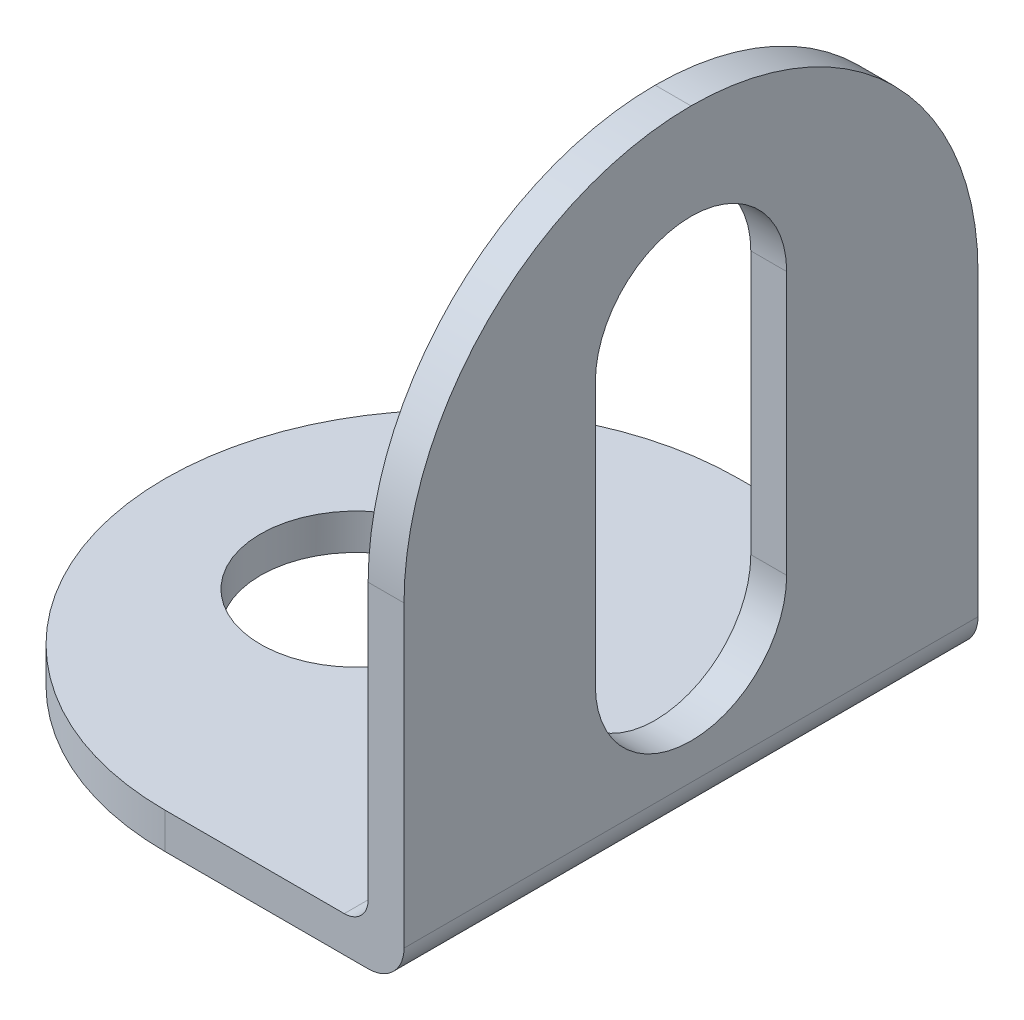
ISO-10303-21;
HEADER;
FILE_DESCRIPTION(('STEP AP214'),'2;1');
FILE_NAME('part.step','',(''),(''),'','','');
FILE_SCHEMA(('AUTOMOTIVE_DESIGN { 1 0 10303 214 1 1 1 1 }'));
ENDSEC;
DATA;
#1=APPLICATION_CONTEXT('core data for automotive mechanical design processes');
#2=APPLICATION_PROTOCOL_DEFINITION('international standard','automotive_design',2000,#1);
#3=PRODUCT_CONTEXT('',#1,'mechanical');
#4=PRODUCT('Part','Part','',(#3));
#5=PRODUCT_RELATED_PRODUCT_CATEGORY('part','',(#4));
#6=PRODUCT_DEFINITION_FORMATION('','',#4);
#7=PRODUCT_DEFINITION_CONTEXT('part definition',#1,'design');
#8=PRODUCT_DEFINITION('design','',#6,#7);
#9=PRODUCT_DEFINITION_SHAPE('','',#8);
#10=(LENGTH_UNIT() NAMED_UNIT(*) SI_UNIT(.MILLI.,.METRE.));
#11=(NAMED_UNIT(*) PLANE_ANGLE_UNIT() SI_UNIT($,.RADIAN.));
#12=(NAMED_UNIT(*) SI_UNIT($,.STERADIAN.) SOLID_ANGLE_UNIT());
#13=UNCERTAINTY_MEASURE_WITH_UNIT(LENGTH_MEASURE(1.E-05),#10,'distance_accuracy_value','');
#14=(GEOMETRIC_REPRESENTATION_CONTEXT(3) GLOBAL_UNCERTAINTY_ASSIGNED_CONTEXT((#13)) GLOBAL_UNIT_ASSIGNED_CONTEXT((#10,
#11,#12)) REPRESENTATION_CONTEXT('',''));
#15=CARTESIAN_POINT('',(0.,0.,0.));
#16=DIRECTION('',(0.,0.,1.));
#17=DIRECTION('',(1.,0.,0.));
#18=AXIS2_PLACEMENT_3D('',#15,#16,#17);
#19=CARTESIAN_POINT('',(0.,0.75,6.));
#20=DIRECTION('',(0.,-1.,0.));
#21=DIRECTION('',(1.,0.,0.));
#22=AXIS2_PLACEMENT_3D('',#19,#20,#21);
#23=PLANE('',#22);
#24=CARTESIAN_POINT('',(-7.,0.749999999999999,0.));
#25=DIRECTION('',(0.,1.,0.));
#26=DIRECTION('',(-1.,0.,0.));
#27=AXIS2_PLACEMENT_3D('',#24,#25,#26);
#28=CIRCLE('',#27,2.);
#29=CARTESIAN_POINT('',(-9.,0.749999999999999,0.));
#30=VERTEX_POINT('',#29);
#31=EDGE_CURVE('E186',#30,#30,#28,.T.);
#32=ORIENTED_EDGE('',*,*,#31,.F.);
#33=EDGE_LOOP('',(#32));
#34=FACE_BOUND('',#33,.T.);
#35=DIRECTION('',(-1.,0.,0.));
#36=VECTOR('',#35,1.);
#37=CARTESIAN_POINT('',(0.,0.75,6.));
#38=LINE('',#37,#36);
#39=CARTESIAN_POINT('',(-1.25,0.75,6.));
#40=VERTEX_POINT('',#39);
#41=CARTESIAN_POINT('',(-5.,0.749999999999999,6.));
#42=VERTEX_POINT('',#41);
#43=EDGE_CURVE('E195',#40,#42,#38,.T.);
#44=ORIENTED_EDGE('',*,*,#43,.F.);
#45=DIRECTION('',(0.,0.,-1.));
#46=VECTOR('',#45,1.);
#47=CARTESIAN_POINT('',(-1.25,0.75,-6.));
#48=LINE('',#47,#46);
#49=CARTESIAN_POINT('',(-1.25,0.75,-6.));
#50=VERTEX_POINT('',#49);
#51=EDGE_CURVE('E284',#40,#50,#48,.T.);
#52=ORIENTED_EDGE('',*,*,#51,.T.);
#53=DIRECTION('',(-1.,0.,0.));
#54=VECTOR('',#53,1.);
#55=CARTESIAN_POINT('',(0.,0.75,-6.));
#56=LINE('',#55,#54);
#57=CARTESIAN_POINT('',(-5.,0.749999999999999,-6.));
#58=VERTEX_POINT('',#57);
#59=EDGE_CURVE('E211',#50,#58,#56,.T.);
#60=ORIENTED_EDGE('',*,*,#59,.T.);
#61=CARTESIAN_POINT('',(-5.,0.749999999999999,0.));
#62=DIRECTION('',(0.,-1.,0.));
#63=DIRECTION('',(1.,0.,0.));
#64=AXIS2_PLACEMENT_3D('',#61,#62,#63);
#65=CIRCLE('',#64,6.);
#66=CARTESIAN_POINT('',(-11.,0.749999999999999,0.));
#67=VERTEX_POINT('',#66);
#68=EDGE_CURVE('E210',#58,#67,#65,.F.);
#69=ORIENTED_EDGE('',*,*,#68,.T.);
#70=CARTESIAN_POINT('',(-5.,0.749999999999999,0.));
#71=DIRECTION('',(0.,-1.,0.));
#72=DIRECTION('',(1.,0.,0.));
#73=AXIS2_PLACEMENT_3D('',#70,#71,#72);
#74=CIRCLE('',#73,6.);
#75=EDGE_CURVE('E227',#67,#42,#74,.F.);
#76=ORIENTED_EDGE('',*,*,#75,.T.);
#77=EDGE_LOOP('',(#44,#52,#60,#69,#76));
#78=FACE_BOUND('',#77,.T.);
#79=ADVANCED_FACE('F39',(#34,#78),#23,.F.);
#80=CARTESIAN_POINT('',(0.,0.,6.));
#81=DIRECTION('',(0.,-1.,0.));
#82=DIRECTION('',(1.,0.,0.));
#83=AXIS2_PLACEMENT_3D('',#80,#81,#82);
#84=PLANE('',#83);
#85=CARTESIAN_POINT('',(-7.,0.,0.));
#86=DIRECTION('',(0.,-1.,0.));
#87=DIRECTION('',(1.,0.,0.));
#88=AXIS2_PLACEMENT_3D('',#85,#86,#87);
#89=CIRCLE('',#88,2.);
#90=CARTESIAN_POINT('',(-5.,0.,0.));
#91=VERTEX_POINT('',#90);
#92=EDGE_CURVE('E190',#91,#91,#89,.F.);
#93=ORIENTED_EDGE('',*,*,#92,.T.);
#94=EDGE_LOOP('',(#93));
#95=FACE_BOUND('',#94,.T.);
#96=DIRECTION('',(-1.,0.,0.));
#97=VECTOR('',#96,1.);
#98=CARTESIAN_POINT('',(0.,0.,-6.));
#99=LINE('',#98,#97);
#100=CARTESIAN_POINT('',(-0.75,0.,-6.));
#101=VERTEX_POINT('',#100);
#102=CARTESIAN_POINT('',(-5.,0.,-6.));
#103=VERTEX_POINT('',#102);
#104=EDGE_CURVE('E214',#101,#103,#99,.T.);
#105=ORIENTED_EDGE('',*,*,#104,.F.);
#106=DIRECTION('',(0.,0.,-1.));
#107=VECTOR('',#106,1.);
#108=CARTESIAN_POINT('',(-0.75,0.,6.));
#109=LINE('',#108,#107);
#110=CARTESIAN_POINT('',(-0.75,0.,6.));
#111=VERTEX_POINT('',#110);
#112=EDGE_CURVE('E278',#101,#111,#109,.F.);
#113=ORIENTED_EDGE('',*,*,#112,.T.);
#114=DIRECTION('',(-1.,0.,0.));
#115=VECTOR('',#114,1.);
#116=CARTESIAN_POINT('',(0.,0.,6.));
#117=LINE('',#116,#115);
#118=CARTESIAN_POINT('',(-5.,0.,6.));
#119=VERTEX_POINT('',#118);
#120=EDGE_CURVE('E198',#111,#119,#117,.T.);
#121=ORIENTED_EDGE('',*,*,#120,.T.);
#122=CARTESIAN_POINT('',(-5.,0.,0.));
#123=DIRECTION('',(0.,-1.,0.));
#124=DIRECTION('',(1.,0.,0.));
#125=AXIS2_PLACEMENT_3D('',#122,#123,#124);
#126=CIRCLE('',#125,6.);
#127=CARTESIAN_POINT('',(-11.,0.,0.));
#128=VERTEX_POINT('',#127);
#129=EDGE_CURVE('E242',#119,#128,#126,.T.);
#130=ORIENTED_EDGE('',*,*,#129,.T.);
#131=CARTESIAN_POINT('',(-5.,0.,0.));
#132=DIRECTION('',(0.,-1.,0.));
#133=DIRECTION('',(1.,0.,0.));
#134=AXIS2_PLACEMENT_3D('',#131,#132,#133);
#135=CIRCLE('',#134,6.);
#136=EDGE_CURVE('E238',#128,#103,#135,.T.);
#137=ORIENTED_EDGE('',*,*,#136,.T.);
#138=EDGE_LOOP('',(#105,#113,#121,#130,#137));
#139=FACE_BOUND('',#138,.T.);
#140=ADVANCED_FACE('F344',(#95,#139),#84,.T.);
#141=CARTESIAN_POINT('',(0.,13.,6.));
#142=DIRECTION('',(1.,0.,0.));
#143=DIRECTION('',(0.,0.,-1.));
#144=AXIS2_PLACEMENT_3D('',#141,#142,#143);
#145=PLANE('',#144);
#146=DIRECTION('',(0.,-1.,0.));
#147=VECTOR('',#146,1.);
#148=CARTESIAN_POINT('',(0.,9.,-2.));
#149=LINE('',#148,#147);
#150=CARTESIAN_POINT('',(0.,9.,-2.));
#151=VERTEX_POINT('',#150);
#152=CARTESIAN_POINT('',(0.,3.5,-2.));
#153=VERTEX_POINT('',#152);
#154=EDGE_CURVE('E155',#151,#153,#149,.T.);
#155=ORIENTED_EDGE('',*,*,#154,.T.);
#156=CARTESIAN_POINT('',(0.,3.5,0.));
#157=DIRECTION('',(1.,0.,0.));
#158=DIRECTION('',(0.,0.,-1.));
#159=AXIS2_PLACEMENT_3D('',#156,#157,#158);
#160=CIRCLE('',#159,2.);
#161=CARTESIAN_POINT('',(0.,3.5,2.));
#162=VERTEX_POINT('',#161);
#163=EDGE_CURVE('E141',#153,#162,#160,.F.);
#164=ORIENTED_EDGE('',*,*,#163,.T.);
#165=DIRECTION('',(0.,1.,0.));
#166=VECTOR('',#165,1.);
#167=CARTESIAN_POINT('',(0.,9.,2.));
#168=LINE('',#167,#166);
#169=CARTESIAN_POINT('',(0.,9.,2.));
#170=VERTEX_POINT('',#169);
#171=EDGE_CURVE('E177',#162,#170,#168,.T.);
#172=ORIENTED_EDGE('',*,*,#171,.T.);
#173=CARTESIAN_POINT('',(0.,9.,0.));
#174=DIRECTION('',(1.,0.,0.));
#175=DIRECTION('',(0.,0.,-1.));
#176=AXIS2_PLACEMENT_3D('',#173,#174,#175);
#177=CIRCLE('',#176,2.);
#178=EDGE_CURVE('E164',#170,#151,#177,.F.);
#179=ORIENTED_EDGE('',*,*,#178,.T.);
#180=EDGE_LOOP('',(#155,#164,#172,#179));
#181=FACE_BOUND('',#180,.T.);
#182=DIRECTION('',(0.,-1.,0.));
#183=VECTOR('',#182,1.);
#184=CARTESIAN_POINT('',(0.,13.,6.));
#185=LINE('',#184,#183);
#186=CARTESIAN_POINT('',(0.,7.,6.));
#187=VERTEX_POINT('',#186);
#188=CARTESIAN_POINT('',(0.,0.750000000000004,6.));
#189=VERTEX_POINT('',#188);
#190=EDGE_CURVE('E202',#187,#189,#185,.T.);
#191=ORIENTED_EDGE('',*,*,#190,.T.);
#192=DIRECTION('',(0.,0.,-1.));
#193=VECTOR('',#192,1.);
#194=CARTESIAN_POINT('',(0.,0.750000000000001,6.));
#195=LINE('',#194,#193);
#196=CARTESIAN_POINT('',(0.,0.750000000000004,-6.));
#197=VERTEX_POINT('',#196);
#198=EDGE_CURVE('E265',#189,#197,#195,.T.);
#199=ORIENTED_EDGE('',*,*,#198,.T.);
#200=DIRECTION('',(0.,-1.,0.));
#201=VECTOR('',#200,1.);
#202=CARTESIAN_POINT('',(0.,13.,-6.));
#203=LINE('',#202,#201);
#204=CARTESIAN_POINT('',(0.,7.,-6.));
#205=VERTEX_POINT('',#204);
#206=EDGE_CURVE('E218',#205,#197,#203,.T.);
#207=ORIENTED_EDGE('',*,*,#206,.F.);
#208=CARTESIAN_POINT('',(0.,7.,0.));
#209=DIRECTION('',(1.,0.,0.));
#210=DIRECTION('',(0.,0.,-1.));
#211=AXIS2_PLACEMENT_3D('',#208,#209,#210);
#212=CIRCLE('',#211,6.);
#213=CARTESIAN_POINT('',(0.,13.,0.));
#214=VERTEX_POINT('',#213);
#215=EDGE_CURVE('E256',#205,#214,#212,.T.);
#216=ORIENTED_EDGE('',*,*,#215,.T.);
#217=CARTESIAN_POINT('',(0.,7.,0.));
#218=DIRECTION('',(1.,0.,0.));
#219=DIRECTION('',(0.,0.,-1.));
#220=AXIS2_PLACEMENT_3D('',#217,#218,#219);
#221=CIRCLE('',#220,6.);
#222=EDGE_CURVE('E253',#214,#187,#221,.T.);
#223=ORIENTED_EDGE('',*,*,#222,.T.);
#224=EDGE_LOOP('',(#191,#199,#207,#216,#223));
#225=FACE_BOUND('',#224,.T.);
#226=ADVANCED_FACE('F162',(#181,#225),#145,.T.);
#227=CARTESIAN_POINT('',(-0.75,13.,6.));
#228=DIRECTION('',(1.,0.,0.));
#229=DIRECTION('',(0.,0.,-1.));
#230=AXIS2_PLACEMENT_3D('',#227,#228,#229);
#231=PLANE('',#230);
#232=CARTESIAN_POINT('',(-0.75,3.5,0.));
#233=DIRECTION('',(-1.,0.,0.));
#234=DIRECTION('',(0.,0.,1.));
#235=AXIS2_PLACEMENT_3D('',#232,#233,#234);
#236=CIRCLE('',#235,2.);
#237=CARTESIAN_POINT('',(-0.75,3.5,-2.));
#238=VERTEX_POINT('',#237);
#239=CARTESIAN_POINT('',(-0.75,3.5,2.));
#240=VERTEX_POINT('',#239);
#241=EDGE_CURVE('E168',#238,#240,#236,.T.);
#242=ORIENTED_EDGE('',*,*,#241,.F.);
#243=DIRECTION('',(0.,-1.,0.));
#244=VECTOR('',#243,1.);
#245=CARTESIAN_POINT('',(-0.75,9.,-2.));
#246=LINE('',#245,#244);
#247=CARTESIAN_POINT('',(-0.75,9.,-2.));
#248=VERTEX_POINT('',#247);
#249=EDGE_CURVE('E158',#248,#238,#246,.T.);
#250=ORIENTED_EDGE('',*,*,#249,.F.);
#251=CARTESIAN_POINT('',(-0.75,9.,0.));
#252=DIRECTION('',(-1.,0.,0.));
#253=DIRECTION('',(0.,0.,1.));
#254=AXIS2_PLACEMENT_3D('',#251,#252,#253);
#255=CIRCLE('',#254,2.);
#256=CARTESIAN_POINT('',(-0.750000000000001,9.,2.));
#257=VERTEX_POINT('',#256);
#258=EDGE_CURVE('E172',#257,#248,#255,.T.);
#259=ORIENTED_EDGE('',*,*,#258,.F.);
#260=DIRECTION('',(0.,1.,0.));
#261=VECTOR('',#260,1.);
#262=CARTESIAN_POINT('',(-0.75,9.,2.));
#263=LINE('',#262,#261);
#264=EDGE_CURVE('E63',#240,#257,#263,.T.);
#265=ORIENTED_EDGE('',*,*,#264,.F.);
#266=EDGE_LOOP('',(#242,#250,#259,#265));
#267=FACE_BOUND('',#266,.T.);
#268=DIRECTION('',(0.,1.,0.));
#269=VECTOR('',#268,1.);
#270=CARTESIAN_POINT('',(-0.75,13.,-6.));
#271=LINE('',#270,#269);
#272=CARTESIAN_POINT('',(-0.75,7.,-6.));
#273=VERTEX_POINT('',#272);
#274=CARTESIAN_POINT('',(-0.75,1.25,-6.));
#275=VERTEX_POINT('',#274);
#276=EDGE_CURVE('E199',#273,#275,#271,.F.);
#277=ORIENTED_EDGE('',*,*,#276,.T.);
#278=DIRECTION('',(0.,0.,-1.));
#279=VECTOR('',#278,1.);
#280=CARTESIAN_POINT('',(-0.75,1.25,6.));
#281=LINE('',#280,#279);
#282=CARTESIAN_POINT('',(-0.75,1.25,6.));
#283=VERTEX_POINT('',#282);
#284=EDGE_CURVE('E288',#275,#283,#281,.F.);
#285=ORIENTED_EDGE('',*,*,#284,.T.);
#286=DIRECTION('',(0.,1.,0.));
#287=VECTOR('',#286,1.);
#288=CARTESIAN_POINT('',(-0.75,13.,6.));
#289=LINE('',#288,#287);
#290=CARTESIAN_POINT('',(-0.75,7.,6.));
#291=VERTEX_POINT('',#290);
#292=EDGE_CURVE('E206',#291,#283,#289,.F.);
#293=ORIENTED_EDGE('',*,*,#292,.F.);
#294=CARTESIAN_POINT('',(-0.75,7.,0.));
#295=DIRECTION('',(1.,0.,0.));
#296=DIRECTION('',(0.,0.,-1.));
#297=AXIS2_PLACEMENT_3D('',#294,#295,#296);
#298=CIRCLE('',#297,6.);
#299=CARTESIAN_POINT('',(-0.75,13.,0.));
#300=VERTEX_POINT('',#299);
#301=EDGE_CURVE('E259',#291,#300,#298,.F.);
#302=ORIENTED_EDGE('',*,*,#301,.T.);
#303=CARTESIAN_POINT('',(-0.75,7.,0.));
#304=DIRECTION('',(1.,0.,0.));
#305=DIRECTION('',(0.,0.,-1.));
#306=AXIS2_PLACEMENT_3D('',#303,#304,#305);
#307=CIRCLE('',#306,6.);
#308=EDGE_CURVE('E262',#300,#273,#307,.F.);
#309=ORIENTED_EDGE('',*,*,#308,.T.);
#310=EDGE_LOOP('',(#277,#285,#293,#302,#309));
#311=FACE_BOUND('',#310,.T.);
#312=ADVANCED_FACE('F300',(#267,#311),#231,.F.);
#313=CARTESIAN_POINT('',(0.,0.,6.));
#314=DIRECTION('',(0.,0.,-1.));
#315=DIRECTION('',(-1.,0.,0.));
#316=AXIS2_PLACEMENT_3D('',#313,#314,#315);
#317=PLANE('',#316);
#318=ORIENTED_EDGE('',*,*,#120,.F.);
#319=CARTESIAN_POINT('',(-0.75,0.750000000000001,6.));
#320=DIRECTION('',(0.,0.,-1.));
#321=DIRECTION('',(-1.,0.,0.));
#322=AXIS2_PLACEMENT_3D('',#319,#320,#321);
#323=CIRCLE('',#322,0.75);
#324=EDGE_CURVE('E281',#111,#189,#323,.F.);
#325=ORIENTED_EDGE('',*,*,#324,.T.);
#326=ORIENTED_EDGE('',*,*,#190,.F.);
#327=DIRECTION('',(1.,0.,0.));
#328=VECTOR('',#327,1.);
#329=CARTESIAN_POINT('',(-0.75,7.,6.));
#330=LINE('',#329,#328);
#331=EDGE_CURVE('E231',#187,#291,#330,.F.);
#332=ORIENTED_EDGE('',*,*,#331,.T.);
#333=ORIENTED_EDGE('',*,*,#292,.T.);
#334=CARTESIAN_POINT('',(-1.25,1.25,6.));
#335=DIRECTION('',(0.,0.,-1.));
#336=DIRECTION('',(-1.,0.,0.));
#337=AXIS2_PLACEMENT_3D('',#334,#335,#336);
#338=CIRCLE('',#337,0.5);
#339=EDGE_CURVE('E11',#283,#40,#338,.T.);
#340=ORIENTED_EDGE('',*,*,#339,.T.);
#341=ORIENTED_EDGE('',*,*,#43,.T.);
#342=DIRECTION('',(0.,1.,0.));
#343=VECTOR('',#342,1.);
#344=CARTESIAN_POINT('',(-5.,0.,6.));
#345=LINE('',#344,#343);
#346=EDGE_CURVE('E234',#42,#119,#345,.F.);
#347=ORIENTED_EDGE('',*,*,#346,.T.);
#348=EDGE_LOOP('',(#318,#325,#326,#332,#333,#340,#341,#347));
#349=FACE_BOUND('',#348,.T.);
#350=ADVANCED_FACE('F307',(#349),#317,.F.);
#351=CARTESIAN_POINT('',(0.,0.,-6.));
#352=DIRECTION('',(0.,0.,-1.));
#353=DIRECTION('',(-1.,0.,0.));
#354=AXIS2_PLACEMENT_3D('',#351,#352,#353);
#355=PLANE('',#354);
#356=ORIENTED_EDGE('',*,*,#206,.T.);
#357=CARTESIAN_POINT('',(-0.75,0.750000000000001,-6.));
#358=DIRECTION('',(0.,0.,-1.));
#359=DIRECTION('',(-1.,0.,0.));
#360=AXIS2_PLACEMENT_3D('',#357,#358,#359);
#361=CIRCLE('',#360,0.75);
#362=EDGE_CURVE('E275',#197,#101,#361,.T.);
#363=ORIENTED_EDGE('',*,*,#362,.T.);
#364=ORIENTED_EDGE('',*,*,#104,.T.);
#365=DIRECTION('',(0.,1.,0.));
#366=VECTOR('',#365,1.);
#367=CARTESIAN_POINT('',(-5.,0.,-6.));
#368=LINE('',#367,#366);
#369=EDGE_CURVE('E249',#103,#58,#368,.T.);
#370=ORIENTED_EDGE('',*,*,#369,.T.);
#371=ORIENTED_EDGE('',*,*,#59,.F.);
#372=CARTESIAN_POINT('',(-1.25,1.25,-6.));
#373=DIRECTION('',(0.,0.,-1.));
#374=DIRECTION('',(-1.,0.,0.));
#375=AXIS2_PLACEMENT_3D('',#372,#373,#374);
#376=CIRCLE('',#375,0.5);
#377=EDGE_CURVE('E48',#50,#275,#376,.F.);
#378=ORIENTED_EDGE('',*,*,#377,.T.);
#379=ORIENTED_EDGE('',*,*,#276,.F.);
#380=DIRECTION('',(1.,0.,0.));
#381=VECTOR('',#380,1.);
#382=CARTESIAN_POINT('',(0.,7.,-6.));
#383=LINE('',#382,#381);
#384=EDGE_CURVE('E245',#273,#205,#383,.T.);
#385=ORIENTED_EDGE('',*,*,#384,.T.);
#386=EDGE_LOOP('',(#356,#363,#364,#370,#371,#378,#379,#385));
#387=FACE_BOUND('',#386,.T.);
#388=ADVANCED_FACE('F294',(#387),#355,.T.);
#389=CARTESIAN_POINT('',(-5.,0.,0.));
#390=DIRECTION('',(0.,1.,0.));
#391=DIRECTION('',(0.,0.,1.));
#392=AXIS2_PLACEMENT_3D('',#389,#390,#391);
#393=CYLINDRICAL_SURFACE('',#392,6.);
#394=ORIENTED_EDGE('',*,*,#369,.F.);
#395=ORIENTED_EDGE('',*,*,#136,.F.);
#396=DIRECTION('',(0.,1.,0.));
#397=VECTOR('',#396,1.);
#398=CARTESIAN_POINT('',(-11.,0.,0.));
#399=LINE('',#398,#397);
#400=EDGE_CURVE('E215',#67,#128,#399,.F.);
#401=ORIENTED_EDGE('',*,*,#400,.F.);
#402=ORIENTED_EDGE('',*,*,#68,.F.);
#403=EDGE_LOOP('',(#394,#395,#401,#402));
#404=FACE_BOUND('',#403,.T.);
#405=ADVANCED_FACE('F341',(#404),#393,.T.);
#406=CARTESIAN_POINT('',(-5.,0.,0.));
#407=DIRECTION('',(0.,-1.,0.));
#408=DIRECTION('',(0.,0.,-1.));
#409=AXIS2_PLACEMENT_3D('',#406,#407,#408);
#410=CYLINDRICAL_SURFACE('',#409,6.);
#411=ORIENTED_EDGE('',*,*,#129,.F.);
#412=ORIENTED_EDGE('',*,*,#346,.F.);
#413=ORIENTED_EDGE('',*,*,#75,.F.);
#414=ORIENTED_EDGE('',*,*,#400,.T.);
#415=EDGE_LOOP('',(#411,#412,#413,#414));
#416=FACE_BOUND('',#415,.T.);
#417=ADVANCED_FACE('F315',(#416),#410,.T.);
#418=CARTESIAN_POINT('',(-0.75,7.,0.));
#419=DIRECTION('',(-1.,0.,0.));
#420=DIRECTION('',(0.,0.,1.));
#421=AXIS2_PLACEMENT_3D('',#418,#419,#420);
#422=CYLINDRICAL_SURFACE('',#421,6.);
#423=DIRECTION('',(1.,0.,0.));
#424=VECTOR('',#423,1.);
#425=CARTESIAN_POINT('',(0.,13.,0.));
#426=LINE('',#425,#424);
#427=EDGE_CURVE('E194',#300,#214,#426,.T.);
#428=ORIENTED_EDGE('',*,*,#427,.F.);
#429=ORIENTED_EDGE('',*,*,#301,.F.);
#430=ORIENTED_EDGE('',*,*,#331,.F.);
#431=ORIENTED_EDGE('',*,*,#222,.F.);
#432=EDGE_LOOP('',(#428,#429,#430,#431));
#433=FACE_BOUND('',#432,.T.);
#434=ADVANCED_FACE('F331',(#433),#422,.T.);
#435=CARTESIAN_POINT('',(0.,7.,0.));
#436=DIRECTION('',(1.,0.,0.));
#437=DIRECTION('',(0.,0.,-1.));
#438=AXIS2_PLACEMENT_3D('',#435,#436,#437);
#439=CYLINDRICAL_SURFACE('',#438,6.);
#440=ORIENTED_EDGE('',*,*,#308,.F.);
#441=ORIENTED_EDGE('',*,*,#427,.T.);
#442=ORIENTED_EDGE('',*,*,#215,.F.);
#443=ORIENTED_EDGE('',*,*,#384,.F.);
#444=EDGE_LOOP('',(#440,#441,#442,#443));
#445=FACE_BOUND('',#444,.T.);
#446=ADVANCED_FACE('F326',(#445),#439,.T.);
#447=CARTESIAN_POINT('',(-7.,-5.65685424949238,0.));
#448=DIRECTION('',(0.,1.,0.));
#449=DIRECTION('',(-1.,0.,0.));
#450=AXIS2_PLACEMENT_3D('',#447,#448,#449);
#451=CYLINDRICAL_SURFACE('',#450,2.);
#452=ORIENTED_EDGE('',*,*,#31,.T.);
#453=EDGE_LOOP('',(#452));
#454=FACE_BOUND('',#453,.T.);
#455=ORIENTED_EDGE('',*,*,#92,.F.);
#456=EDGE_LOOP('',(#455));
#457=FACE_BOUND('',#456,.T.);
#458=ADVANCED_FACE('F339',(#454,#457),#451,.F.);
#459=CARTESIAN_POINT('',(-0.75,0.750000000000001,6.));
#460=DIRECTION('',(0.,0.,-1.));
#461=DIRECTION('',(-1.,0.,0.));
#462=AXIS2_PLACEMENT_3D('',#459,#460,#461);
#463=CYLINDRICAL_SURFACE('',#462,0.75);
#464=ORIENTED_EDGE('',*,*,#324,.F.);
#465=ORIENTED_EDGE('',*,*,#112,.F.);
#466=ORIENTED_EDGE('',*,*,#362,.F.);
#467=ORIENTED_EDGE('',*,*,#198,.F.);
#468=EDGE_LOOP('',(#464,#465,#466,#467));
#469=FACE_BOUND('',#468,.T.);
#470=ADVANCED_FACE('F322',(#469),#463,.T.);
#471=CARTESIAN_POINT('',(-1.25,1.25,6.));
#472=DIRECTION('',(0.,0.,1.));
#473=DIRECTION('',(1.,0.,0.));
#474=AXIS2_PLACEMENT_3D('',#471,#472,#473);
#475=CYLINDRICAL_SURFACE('',#474,0.5);
#476=ORIENTED_EDGE('',*,*,#339,.F.);
#477=ORIENTED_EDGE('',*,*,#284,.F.);
#478=ORIENTED_EDGE('',*,*,#377,.F.);
#479=ORIENTED_EDGE('',*,*,#51,.F.);
#480=EDGE_LOOP('',(#476,#477,#478,#479));
#481=FACE_BOUND('',#480,.T.);
#482=ADVANCED_FACE('F41',(#481),#475,.F.);
#483=CARTESIAN_POINT('',(10.3077640640441,9.,-2.));
#484=DIRECTION('',(0.,0.,-1.));
#485=DIRECTION('',(0.,1.,0.));
#486=AXIS2_PLACEMENT_3D('',#483,#484,#485);
#487=PLANE('',#486);
#488=DIRECTION('',(-1.,0.,0.));
#489=VECTOR('',#488,1.);
#490=CARTESIAN_POINT('',(10.3077640640441,9.,-2.));
#491=LINE('',#490,#489);
#492=EDGE_CURVE('E55',#151,#248,#491,.T.);
#493=ORIENTED_EDGE('',*,*,#492,.T.);
#494=ORIENTED_EDGE('',*,*,#249,.T.);
#495=DIRECTION('',(-1.,0.,0.));
#496=VECTOR('',#495,1.);
#497=CARTESIAN_POINT('',(10.3077640640441,3.5,-2.));
#498=LINE('',#497,#496);
#499=EDGE_CURVE('E145',#153,#238,#498,.T.);
#500=ORIENTED_EDGE('',*,*,#499,.F.);
#501=ORIENTED_EDGE('',*,*,#154,.F.);
#502=EDGE_LOOP('',(#493,#494,#500,#501));
#503=FACE_BOUND('',#502,.T.);
#504=ADVANCED_FACE('F154',(#503),#487,.F.);
#505=CARTESIAN_POINT('',(10.3077640640441,3.5,0.));
#506=DIRECTION('',(-1.,0.,0.));
#507=DIRECTION('',(0.,0.,1.));
#508=AXIS2_PLACEMENT_3D('',#505,#506,#507);
#509=CYLINDRICAL_SURFACE('',#508,2.);
#510=ORIENTED_EDGE('',*,*,#499,.T.);
#511=ORIENTED_EDGE('',*,*,#241,.T.);
#512=DIRECTION('',(-1.,0.,0.));
#513=VECTOR('',#512,1.);
#514=CARTESIAN_POINT('',(10.3077640640441,3.5,2.));
#515=LINE('',#514,#513);
#516=EDGE_CURVE('E147',#162,#240,#515,.T.);
#517=ORIENTED_EDGE('',*,*,#516,.F.);
#518=ORIENTED_EDGE('',*,*,#163,.F.);
#519=EDGE_LOOP('',(#510,#511,#517,#518));
#520=FACE_BOUND('',#519,.T.);
#521=ADVANCED_FACE('F143',(#520),#509,.F.);
#522=CARTESIAN_POINT('',(10.3077640640441,9.,2.));
#523=DIRECTION('',(0.,0.,1.));
#524=DIRECTION('',(0.,-1.,0.));
#525=AXIS2_PLACEMENT_3D('',#522,#523,#524);
#526=PLANE('',#525);
#527=ORIENTED_EDGE('',*,*,#516,.T.);
#528=ORIENTED_EDGE('',*,*,#264,.T.);
#529=DIRECTION('',(-1.,0.,0.));
#530=VECTOR('',#529,1.);
#531=CARTESIAN_POINT('',(10.3077640640441,9.,2.));
#532=LINE('',#531,#530);
#533=EDGE_CURVE('E176',#170,#257,#532,.T.);
#534=ORIENTED_EDGE('',*,*,#533,.F.);
#535=ORIENTED_EDGE('',*,*,#171,.F.);
#536=EDGE_LOOP('',(#527,#528,#534,#535));
#537=FACE_BOUND('',#536,.T.);
#538=ADVANCED_FACE('F417',(#537),#526,.F.);
#539=CARTESIAN_POINT('',(10.3077640640441,9.,0.));
#540=DIRECTION('',(-1.,0.,0.));
#541=DIRECTION('',(0.,0.,1.));
#542=AXIS2_PLACEMENT_3D('',#539,#540,#541);
#543=CYLINDRICAL_SURFACE('',#542,2.);
#544=ORIENTED_EDGE('',*,*,#533,.T.);
#545=ORIENTED_EDGE('',*,*,#258,.T.);
#546=ORIENTED_EDGE('',*,*,#492,.F.);
#547=ORIENTED_EDGE('',*,*,#178,.F.);
#548=EDGE_LOOP('',(#544,#545,#546,#547));
#549=FACE_BOUND('',#548,.T.);
#550=ADVANCED_FACE('F424',(#549),#543,.F.);
#551=CLOSED_SHELL('',(#79,#140,#226,#312,#350,#388,#405,#417,#434,#446,#458,#470,#482,#504,#521,
#538,#550));
#552=MANIFOLD_SOLID_BREP('B2',#551);
#553=ADVANCED_BREP_SHAPE_REPRESENTATION('',(#18,#552),#14);
#554=SHAPE_DEFINITION_REPRESENTATION(#9,#553);
ENDSEC;
END-ISO-10303-21;
